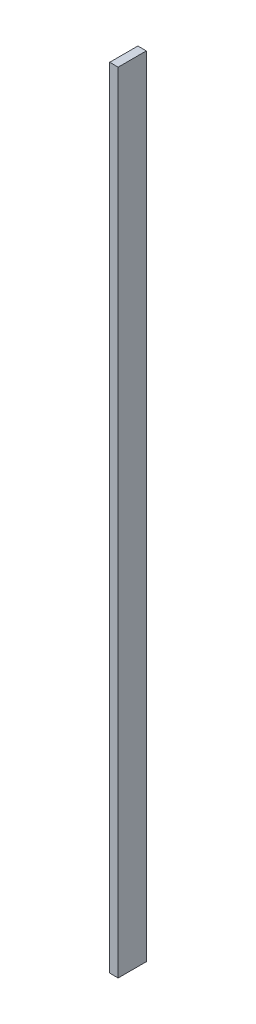
ISO-10303-21;
HEADER;
FILE_DESCRIPTION(('STEP AP214'),'2;1');
FILE_NAME('part.step','',(''),(''),'','','');
FILE_SCHEMA(('AUTOMOTIVE_DESIGN { 1 0 10303 214 1 1 1 1 }'));
ENDSEC;
DATA;
#1=APPLICATION_CONTEXT('core data for automotive mechanical design processes');
#2=APPLICATION_PROTOCOL_DEFINITION('international standard','automotive_design',2000,#1);
#3=PRODUCT_CONTEXT('',#1,'mechanical');
#4=PRODUCT('Part','Part','',(#3));
#5=PRODUCT_RELATED_PRODUCT_CATEGORY('part','',(#4));
#6=PRODUCT_DEFINITION_FORMATION('','',#4);
#7=PRODUCT_DEFINITION_CONTEXT('part definition',#1,'design');
#8=PRODUCT_DEFINITION('design','',#6,#7);
#9=PRODUCT_DEFINITION_SHAPE('','',#8);
#10=(LENGTH_UNIT() NAMED_UNIT(*) SI_UNIT(.MILLI.,.METRE.));
#11=(NAMED_UNIT(*) PLANE_ANGLE_UNIT() SI_UNIT($,.RADIAN.));
#12=(NAMED_UNIT(*) SI_UNIT($,.STERADIAN.) SOLID_ANGLE_UNIT());
#13=UNCERTAINTY_MEASURE_WITH_UNIT(LENGTH_MEASURE(1.E-05),#10,'distance_accuracy_value','');
#14=(GEOMETRIC_REPRESENTATION_CONTEXT(3) GLOBAL_UNCERTAINTY_ASSIGNED_CONTEXT((#13)) GLOBAL_UNIT_ASSIGNED_CONTEXT((#10,
#11,#12)) REPRESENTATION_CONTEXT('',''));
#15=CARTESIAN_POINT('',(0.,0.,0.));
#16=DIRECTION('',(0.,0.,1.));
#17=DIRECTION('',(1.,0.,0.));
#18=AXIS2_PLACEMENT_3D('',#15,#16,#17);
#19=CARTESIAN_POINT('',(3.,60.9865881501019,18.0759581391278));
#20=DIRECTION('',(0.,0.,-1.));
#21=DIRECTION('',(0.,1.,0.));
#22=AXIS2_PLACEMENT_3D('',#19,#20,#21);
#23=PLANE('',#22);
#24=DIRECTION('',(0.,-1.,0.));
#25=VECTOR('',#24,1.);
#26=CARTESIAN_POINT('',(0.,60.9865881501019,18.0759581391278));
#27=LINE('',#26,#25);
#28=CARTESIAN_POINT('',(0.,60.9865881501019,18.0759581391278));
#29=VERTEX_POINT('',#28);
#30=CARTESIAN_POINT('',(0.,-219.013411849898,18.0759581391277));
#31=VERTEX_POINT('',#30);
#32=EDGE_CURVE('E104',#29,#31,#27,.T.);
#33=ORIENTED_EDGE('',*,*,#32,.T.);
#34=DIRECTION('',(-1.,0.,0.));
#35=VECTOR('',#34,1.);
#36=CARTESIAN_POINT('',(3.,-219.013411849898,18.0759581391277));
#37=LINE('',#36,#35);
#38=CARTESIAN_POINT('',(3.,-219.013411849898,18.0759581391277));
#39=VERTEX_POINT('',#38);
#40=EDGE_CURVE('E11',#39,#31,#37,.T.);
#41=ORIENTED_EDGE('',*,*,#40,.F.);
#42=DIRECTION('',(0.,-1.,0.));
#43=VECTOR('',#42,1.);
#44=CARTESIAN_POINT('',(3.,60.9865881501019,18.0759581391278));
#45=LINE('',#44,#43);
#46=CARTESIAN_POINT('',(3.,60.9865881501019,18.0759581391278));
#47=VERTEX_POINT('',#46);
#48=EDGE_CURVE('E92',#47,#39,#45,.T.);
#49=ORIENTED_EDGE('',*,*,#48,.F.);
#50=DIRECTION('',(-1.,0.,0.));
#51=VECTOR('',#50,1.);
#52=CARTESIAN_POINT('',(3.,60.9865881501019,18.0759581391278));
#53=LINE('',#52,#51);
#54=EDGE_CURVE('E100',#47,#29,#53,.T.);
#55=ORIENTED_EDGE('',*,*,#54,.T.);
#56=EDGE_LOOP('',(#33,#41,#49,#55));
#57=FACE_BOUND('',#56,.T.);
#58=ADVANCED_FACE('F41',(#57),#23,.F.);
#59=CARTESIAN_POINT('',(3.,-219.013411849898,18.0759581391277));
#60=DIRECTION('',(0.,1.,0.));
#61=DIRECTION('',(0.,0.,1.));
#62=AXIS2_PLACEMENT_3D('',#59,#60,#61);
#63=PLANE('',#62);
#64=DIRECTION('',(0.,0.,-1.));
#65=VECTOR('',#64,1.);
#66=CARTESIAN_POINT('',(0.,-219.013411849898,18.0759581391277));
#67=LINE('',#66,#65);
#68=CARTESIAN_POINT('',(0.,-219.013411849898,8.07595813912773));
#69=VERTEX_POINT('',#68);
#70=EDGE_CURVE('E96',#31,#69,#67,.T.);
#71=ORIENTED_EDGE('',*,*,#70,.T.);
#72=DIRECTION('',(-1.,0.,0.));
#73=VECTOR('',#72,1.);
#74=CARTESIAN_POINT('',(3.,-219.013411849898,8.07595813912773));
#75=LINE('',#74,#73);
#76=CARTESIAN_POINT('',(3.,-219.013411849898,8.07595813912773));
#77=VERTEX_POINT('',#76);
#78=EDGE_CURVE('E49',#77,#69,#75,.T.);
#79=ORIENTED_EDGE('',*,*,#78,.F.);
#80=DIRECTION('',(0.,0.,-1.));
#81=VECTOR('',#80,1.);
#82=CARTESIAN_POINT('',(3.,-219.013411849898,18.0759581391277));
#83=LINE('',#82,#81);
#84=EDGE_CURVE('E87',#39,#77,#83,.T.);
#85=ORIENTED_EDGE('',*,*,#84,.F.);
#86=ORIENTED_EDGE('',*,*,#40,.T.);
#87=EDGE_LOOP('',(#71,#79,#85,#86));
#88=FACE_BOUND('',#87,.T.);
#89=ADVANCED_FACE('F95',(#88),#63,.F.);
#90=CARTESIAN_POINT('',(3.,60.9865881501019,8.07595813912777));
#91=DIRECTION('',(0.,0.,1.));
#92=DIRECTION('',(0.,-1.,0.));
#93=AXIS2_PLACEMENT_3D('',#90,#91,#92);
#94=PLANE('',#93);
#95=DIRECTION('',(0.,1.,0.));
#96=VECTOR('',#95,1.);
#97=CARTESIAN_POINT('',(0.,60.9865881501019,8.07595813912777));
#98=LINE('',#97,#96);
#99=CARTESIAN_POINT('',(0.,60.9865881501019,8.07595813912777));
#100=VERTEX_POINT('',#99);
#101=EDGE_CURVE('E74',#69,#100,#98,.T.);
#102=ORIENTED_EDGE('',*,*,#101,.T.);
#103=DIRECTION('',(-1.,0.,0.));
#104=VECTOR('',#103,1.);
#105=CARTESIAN_POINT('',(3.,60.9865881501019,8.07595813912777));
#106=LINE('',#105,#104);
#107=CARTESIAN_POINT('',(3.,60.9865881501019,8.07595813912777));
#108=VERTEX_POINT('',#107);
#109=EDGE_CURVE('E97',#108,#100,#106,.T.);
#110=ORIENTED_EDGE('',*,*,#109,.F.);
#111=DIRECTION('',(0.,1.,0.));
#112=VECTOR('',#111,1.);
#113=CARTESIAN_POINT('',(3.,60.9865881501019,8.07595813912777));
#114=LINE('',#113,#112);
#115=EDGE_CURVE('E90',#77,#108,#114,.T.);
#116=ORIENTED_EDGE('',*,*,#115,.F.);
#117=ORIENTED_EDGE('',*,*,#78,.T.);
#118=EDGE_LOOP('',(#102,#110,#116,#117));
#119=FACE_BOUND('',#118,.T.);
#120=ADVANCED_FACE('F98',(#119),#94,.F.);
#121=CARTESIAN_POINT('',(3.,60.9865881501019,18.0759581391278));
#122=DIRECTION('',(0.,-1.,0.));
#123=DIRECTION('',(0.,0.,-1.));
#124=AXIS2_PLACEMENT_3D('',#121,#122,#123);
#125=PLANE('',#124);
#126=DIRECTION('',(0.,0.,1.));
#127=VECTOR('',#126,1.);
#128=CARTESIAN_POINT('',(0.,60.9865881501019,18.0759581391278));
#129=LINE('',#128,#127);
#130=EDGE_CURVE('E80',#100,#29,#129,.T.);
#131=ORIENTED_EDGE('',*,*,#130,.T.);
#132=ORIENTED_EDGE('',*,*,#54,.F.);
#133=DIRECTION('',(0.,0.,1.));
#134=VECTOR('',#133,1.);
#135=CARTESIAN_POINT('',(3.,60.9865881501019,18.0759581391278));
#136=LINE('',#135,#134);
#137=EDGE_CURVE('E57',#108,#47,#136,.T.);
#138=ORIENTED_EDGE('',*,*,#137,.F.);
#139=ORIENTED_EDGE('',*,*,#109,.T.);
#140=EDGE_LOOP('',(#131,#132,#138,#139));
#141=FACE_BOUND('',#140,.T.);
#142=ADVANCED_FACE('F111',(#141),#125,.F.);
#143=CARTESIAN_POINT('',(3.,0.,0.));
#144=DIRECTION('',(1.,0.,0.));
#145=DIRECTION('',(0.,0.,-1.));
#146=AXIS2_PLACEMENT_3D('',#143,#144,#145);
#147=PLANE('',#146);
#148=ORIENTED_EDGE('',*,*,#48,.T.);
#149=ORIENTED_EDGE('',*,*,#84,.T.);
#150=ORIENTED_EDGE('',*,*,#115,.T.);
#151=ORIENTED_EDGE('',*,*,#137,.T.);
#152=EDGE_LOOP('',(#148,#149,#150,#151));
#153=FACE_BOUND('',#152,.T.);
#154=ADVANCED_FACE('F88',(#153),#147,.T.);
#155=CARTESIAN_POINT('',(0.,0.,0.));
#156=DIRECTION('',(1.,0.,0.));
#157=DIRECTION('',(0.,0.,-1.));
#158=AXIS2_PLACEMENT_3D('',#155,#156,#157);
#159=PLANE('',#158);
#160=ORIENTED_EDGE('',*,*,#32,.F.);
#161=ORIENTED_EDGE('',*,*,#130,.F.);
#162=ORIENTED_EDGE('',*,*,#101,.F.);
#163=ORIENTED_EDGE('',*,*,#70,.F.);
#164=EDGE_LOOP('',(#160,#161,#162,#163));
#165=FACE_BOUND('',#164,.T.);
#166=ADVANCED_FACE('F114',(#165),#159,.F.);
#167=CLOSED_SHELL('',(#58,#89,#120,#142,#154,#166));
#168=MANIFOLD_SOLID_BREP('B2',#167);
#169=ADVANCED_BREP_SHAPE_REPRESENTATION('',(#18,#168),#14);
#170=SHAPE_DEFINITION_REPRESENTATION(#9,#169);
ENDSEC;
END-ISO-10303-21;
